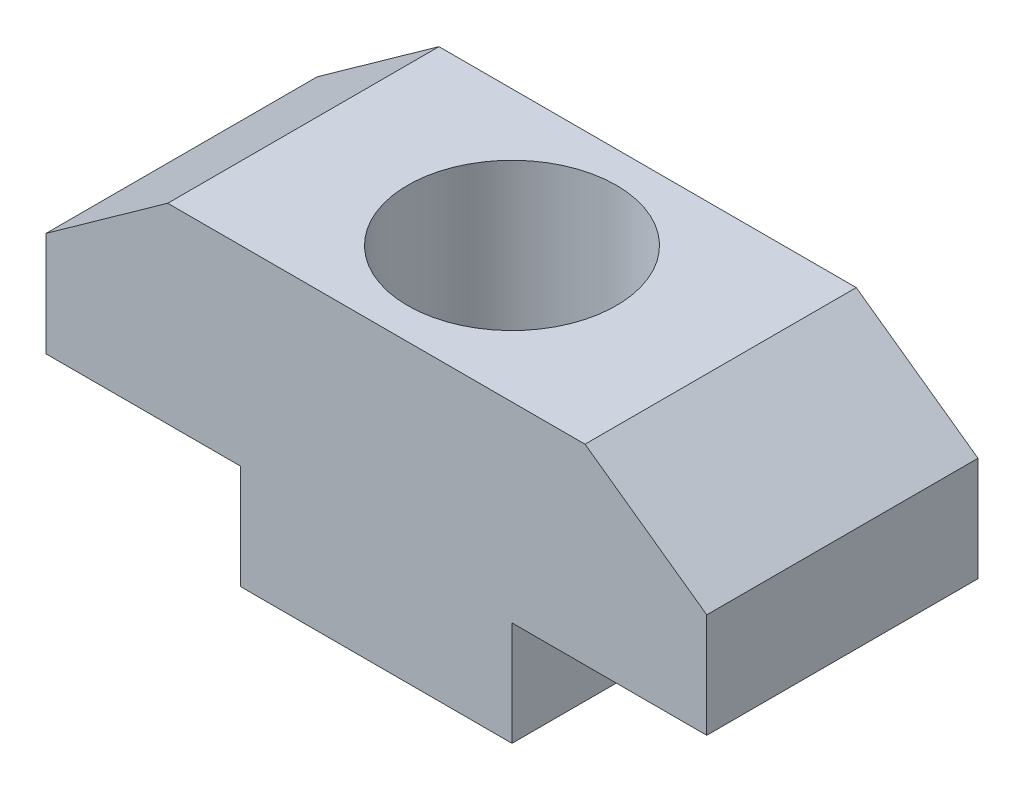
ISO-10303-21;
HEADER;
FILE_DESCRIPTION(('STEP AP214'),'2;1');
FILE_NAME('part.step','',(''),(''),'','','');
FILE_SCHEMA(('AUTOMOTIVE_DESIGN { 1 0 10303 214 1 1 1 1 }'));
ENDSEC;
DATA;
#1=APPLICATION_CONTEXT('core data for automotive mechanical design processes');
#2=APPLICATION_PROTOCOL_DEFINITION('international standard','automotive_design',2000,#1);
#3=PRODUCT_CONTEXT('',#1,'mechanical');
#4=PRODUCT('Part','Part','',(#3));
#5=PRODUCT_RELATED_PRODUCT_CATEGORY('part','',(#4));
#6=PRODUCT_DEFINITION_FORMATION('','',#4);
#7=PRODUCT_DEFINITION_CONTEXT('part definition',#1,'design');
#8=PRODUCT_DEFINITION('design','',#6,#7);
#9=PRODUCT_DEFINITION_SHAPE('','',#8);
#10=(LENGTH_UNIT() NAMED_UNIT(*) SI_UNIT(.MILLI.,.METRE.));
#11=(NAMED_UNIT(*) PLANE_ANGLE_UNIT() SI_UNIT($,.RADIAN.));
#12=(NAMED_UNIT(*) SI_UNIT($,.STERADIAN.) SOLID_ANGLE_UNIT());
#13=UNCERTAINTY_MEASURE_WITH_UNIT(LENGTH_MEASURE(1.E-05),#10,'distance_accuracy_value','');
#14=(GEOMETRIC_REPRESENTATION_CONTEXT(3) GLOBAL_UNCERTAINTY_ASSIGNED_CONTEXT((#13)) GLOBAL_UNIT_ASSIGNED_CONTEXT((#10,
#11,#12)) REPRESENTATION_CONTEXT('',''));
#15=CARTESIAN_POINT('',(0.,0.,0.));
#16=DIRECTION('',(0.,0.,1.));
#17=DIRECTION('',(1.,0.,0.));
#18=AXIS2_PLACEMENT_3D('',#15,#16,#17);
#19=CARTESIAN_POINT('',(0.,0.,7.8));
#20=DIRECTION('',(0.,1.,0.));
#21=DIRECTION('',(0.,0.,1.));
#22=AXIS2_PLACEMENT_3D('',#19,#20,#21);
#23=PLANE('',#22);
#24=DIRECTION('',(0.,0.,-1.));
#25=VECTOR('',#24,1.);
#26=CARTESIAN_POINT('',(5.6,0.,7.8));
#27=LINE('',#26,#25);
#28=CARTESIAN_POINT('',(5.6,0.,7.8));
#29=VERTEX_POINT('',#28);
#30=CARTESIAN_POINT('',(5.6,0.,0.));
#31=VERTEX_POINT('',#30);
#32=EDGE_CURVE('E51',#29,#31,#27,.T.);
#33=ORIENTED_EDGE('',*,*,#32,.F.);
#34=DIRECTION('',(1.,0.,0.));
#35=VECTOR('',#34,1.);
#36=CARTESIAN_POINT('',(0.,0.,7.8));
#37=LINE('',#36,#35);
#38=CARTESIAN_POINT('',(0.,0.,7.8));
#39=VERTEX_POINT('',#38);
#40=EDGE_CURVE('E149',#39,#29,#37,.T.);
#41=ORIENTED_EDGE('',*,*,#40,.F.);
#42=DIRECTION('',(0.,0.,-1.));
#43=VECTOR('',#42,1.);
#44=CARTESIAN_POINT('',(0.,0.,7.8));
#45=LINE('',#44,#43);
#46=CARTESIAN_POINT('',(0.,0.,0.));
#47=VERTEX_POINT('',#46);
#48=EDGE_CURVE('E11',#39,#47,#45,.T.);
#49=ORIENTED_EDGE('',*,*,#48,.T.);
#50=DIRECTION('',(1.,0.,0.));
#51=VECTOR('',#50,1.);
#52=CARTESIAN_POINT('',(0.,0.,0.));
#53=LINE('',#52,#51);
#54=EDGE_CURVE('E160',#47,#31,#53,.T.);
#55=ORIENTED_EDGE('',*,*,#54,.T.);
#56=EDGE_LOOP('',(#33,#41,#49,#55));
#57=FACE_BOUND('',#56,.T.);
#58=ADVANCED_FACE('F36',(#57),#23,.F.);
#59=DIRECTION('',(0.,0.,1.));
#60=VECTOR('',#59,1.);
#61=CARTESIAN_POINT('',(13.4,0.,7.8));
#62=LINE('',#61,#60);
#63=CARTESIAN_POINT('',(13.4,0.,0.));
#64=VERTEX_POINT('',#63);
#65=CARTESIAN_POINT('',(13.4,0.,7.8));
#66=VERTEX_POINT('',#65);
#67=EDGE_CURVE('E59',#64,#66,#62,.T.);
#68=ORIENTED_EDGE('',*,*,#67,.F.);
#69=CARTESIAN_POINT('',(19.,0.,0.));
#70=VERTEX_POINT('',#69);
#71=EDGE_CURVE('E138',#64,#70,#53,.T.);
#72=ORIENTED_EDGE('',*,*,#71,.T.);
#73=DIRECTION('',(0.,0.,-1.));
#74=VECTOR('',#73,1.);
#75=CARTESIAN_POINT('',(19.,0.,7.8));
#76=LINE('',#75,#74);
#77=CARTESIAN_POINT('',(19.,0.,7.8));
#78=VERTEX_POINT('',#77);
#79=EDGE_CURVE('E44',#78,#70,#76,.T.);
#80=ORIENTED_EDGE('',*,*,#79,.F.);
#81=EDGE_CURVE('E147',#66,#78,#37,.T.);
#82=ORIENTED_EDGE('',*,*,#81,.F.);
#83=EDGE_LOOP('',(#68,#72,#80,#82));
#84=FACE_BOUND('',#83,.T.);
#85=ADVANCED_FACE('F203',(#84),#23,.F.);
#86=CARTESIAN_POINT('',(0.,0.,7.8));
#87=DIRECTION('',(1.,0.,0.));
#88=DIRECTION('',(0.,0.,-1.));
#89=AXIS2_PLACEMENT_3D('',#86,#87,#88);
#90=PLANE('',#89);
#91=DIRECTION('',(0.,-1.,0.));
#92=VECTOR('',#91,1.);
#93=CARTESIAN_POINT('',(0.,0.,0.));
#94=LINE('',#93,#92);
#95=CARTESIAN_POINT('',(0.,3.,0.));
#96=VERTEX_POINT('',#95);
#97=EDGE_CURVE('E135',#96,#47,#94,.T.);
#98=ORIENTED_EDGE('',*,*,#97,.T.);
#99=ORIENTED_EDGE('',*,*,#48,.F.);
#100=DIRECTION('',(0.,-1.,0.));
#101=VECTOR('',#100,1.);
#102=CARTESIAN_POINT('',(0.,0.,7.8));
#103=LINE('',#102,#101);
#104=CARTESIAN_POINT('',(0.,3.,7.8));
#105=VERTEX_POINT('',#104);
#106=EDGE_CURVE('E144',#105,#39,#103,.T.);
#107=ORIENTED_EDGE('',*,*,#106,.F.);
#108=DIRECTION('',(0.,0.,-1.));
#109=VECTOR('',#108,1.);
#110=CARTESIAN_POINT('',(0.,3.,7.8));
#111=LINE('',#110,#109);
#112=EDGE_CURVE('E158',#105,#96,#111,.T.);
#113=ORIENTED_EDGE('',*,*,#112,.T.);
#114=EDGE_LOOP('',(#98,#99,#107,#113));
#115=FACE_BOUND('',#114,.T.);
#116=ADVANCED_FACE('F38',(#115),#90,.F.);
#117=CARTESIAN_POINT('',(19.,0.,7.8));
#118=DIRECTION('',(-1.,0.,0.));
#119=DIRECTION('',(0.,0.,1.));
#120=AXIS2_PLACEMENT_3D('',#117,#118,#119);
#121=PLANE('',#120);
#122=DIRECTION('',(0.,1.,0.));
#123=VECTOR('',#122,1.);
#124=CARTESIAN_POINT('',(19.,0.,0.));
#125=LINE('',#124,#123);
#126=CARTESIAN_POINT('',(19.,3.,0.));
#127=VERTEX_POINT('',#126);
#128=EDGE_CURVE('E162',#70,#127,#125,.T.);
#129=ORIENTED_EDGE('',*,*,#128,.T.);
#130=DIRECTION('',(0.,0.,-1.));
#131=VECTOR('',#130,1.);
#132=CARTESIAN_POINT('',(19.,3.,7.8));
#133=LINE('',#132,#131);
#134=CARTESIAN_POINT('',(19.,3.,7.8));
#135=VERTEX_POINT('',#134);
#136=EDGE_CURVE('E177',#135,#127,#133,.T.);
#137=ORIENTED_EDGE('',*,*,#136,.F.);
#138=DIRECTION('',(0.,1.,0.));
#139=VECTOR('',#138,1.);
#140=CARTESIAN_POINT('',(19.,0.,7.8));
#141=LINE('',#140,#139);
#142=EDGE_CURVE('E151',#78,#135,#141,.T.);
#143=ORIENTED_EDGE('',*,*,#142,.F.);
#144=ORIENTED_EDGE('',*,*,#79,.T.);
#145=EDGE_LOOP('',(#129,#137,#143,#144));
#146=FACE_BOUND('',#145,.T.);
#147=ADVANCED_FACE('F184',(#146),#121,.F.);
#148=CARTESIAN_POINT('',(15.5,5.5,7.8));
#149=DIRECTION('',(-0.581238193719096,-0.813733471206735,0.));
#150=DIRECTION('',(0.813733471206735,-0.581238193719096,0.));
#151=AXIS2_PLACEMENT_3D('',#148,#149,#150);
#152=PLANE('',#151);
#153=DIRECTION('',(-0.813733471206735,0.581238193719096,0.));
#154=VECTOR('',#153,1.);
#155=CARTESIAN_POINT('',(15.5,5.5,0.));
#156=LINE('',#155,#154);
#157=CARTESIAN_POINT('',(15.5,5.5,0.));
#158=VERTEX_POINT('',#157);
#159=EDGE_CURVE('E164',#127,#158,#156,.T.);
#160=ORIENTED_EDGE('',*,*,#159,.T.);
#161=DIRECTION('',(0.,0.,-1.));
#162=VECTOR('',#161,1.);
#163=CARTESIAN_POINT('',(15.5,5.5,7.8));
#164=LINE('',#163,#162);
#165=CARTESIAN_POINT('',(15.5,5.5,7.8));
#166=VERTEX_POINT('',#165);
#167=EDGE_CURVE('E174',#166,#158,#164,.T.);
#168=ORIENTED_EDGE('',*,*,#167,.F.);
#169=DIRECTION('',(-0.813733471206735,0.581238193719096,0.));
#170=VECTOR('',#169,1.);
#171=CARTESIAN_POINT('',(15.5,5.5,7.8));
#172=LINE('',#171,#170);
#173=EDGE_CURVE('E153',#135,#166,#172,.T.);
#174=ORIENTED_EDGE('',*,*,#173,.F.);
#175=ORIENTED_EDGE('',*,*,#136,.T.);
#176=EDGE_LOOP('',(#160,#168,#174,#175));
#177=FACE_BOUND('',#176,.T.);
#178=ADVANCED_FACE('F191',(#177),#152,.F.);
#179=CARTESIAN_POINT('',(3.5,5.5,7.8));
#180=DIRECTION('',(0.,-1.,0.));
#181=DIRECTION('',(0.,0.,-1.));
#182=AXIS2_PLACEMENT_3D('',#179,#180,#181);
#183=PLANE('',#182);
#184=CARTESIAN_POINT('',(9.5,5.5,3.9));
#185=DIRECTION('',(0.,-1.,0.));
#186=DIRECTION('',(0.,0.,-1.));
#187=AXIS2_PLACEMENT_3D('',#184,#185,#186);
#188=CIRCLE('',#187,3.);
#189=CARTESIAN_POINT('',(9.5,5.5,0.899999999999999));
#190=VERTEX_POINT('',#189);
#191=EDGE_CURVE('E207',#190,#190,#188,.F.);
#192=ORIENTED_EDGE('',*,*,#191,.F.);
#193=EDGE_LOOP('',(#192));
#194=FACE_BOUND('',#193,.T.);
#195=DIRECTION('',(-1.,0.,0.));
#196=VECTOR('',#195,1.);
#197=CARTESIAN_POINT('',(3.5,5.5,0.));
#198=LINE('',#197,#196);
#199=CARTESIAN_POINT('',(3.5,5.5,0.));
#200=VERTEX_POINT('',#199);
#201=EDGE_CURVE('E166',#158,#200,#198,.T.);
#202=ORIENTED_EDGE('',*,*,#201,.T.);
#203=DIRECTION('',(0.,0.,-1.));
#204=VECTOR('',#203,1.);
#205=CARTESIAN_POINT('',(3.5,5.5,7.8));
#206=LINE('',#205,#204);
#207=CARTESIAN_POINT('',(3.5,5.5,7.8));
#208=VERTEX_POINT('',#207);
#209=EDGE_CURVE('E171',#208,#200,#206,.T.);
#210=ORIENTED_EDGE('',*,*,#209,.F.);
#211=DIRECTION('',(-1.,0.,0.));
#212=VECTOR('',#211,1.);
#213=CARTESIAN_POINT('',(3.5,5.5,7.8));
#214=LINE('',#213,#212);
#215=EDGE_CURVE('E155',#166,#208,#214,.T.);
#216=ORIENTED_EDGE('',*,*,#215,.F.);
#217=ORIENTED_EDGE('',*,*,#167,.T.);
#218=EDGE_LOOP('',(#202,#210,#216,#217));
#219=FACE_BOUND('',#218,.T.);
#220=ADVANCED_FACE('F195',(#194,#219),#183,.F.);
#221=CARTESIAN_POINT('',(0.,3.,7.8));
#222=DIRECTION('',(0.581238193719096,-0.813733471206735,0.));
#223=DIRECTION('',(0.813733471206735,0.581238193719096,0.));
#224=AXIS2_PLACEMENT_3D('',#221,#222,#223);
#225=PLANE('',#224);
#226=DIRECTION('',(-0.813733471206735,-0.581238193719096,0.));
#227=VECTOR('',#226,1.);
#228=CARTESIAN_POINT('',(0.,3.,0.));
#229=LINE('',#228,#227);
#230=EDGE_CURVE('E148',#200,#96,#229,.T.);
#231=ORIENTED_EDGE('',*,*,#230,.T.);
#232=ORIENTED_EDGE('',*,*,#112,.F.);
#233=DIRECTION('',(-0.813733471206735,-0.581238193719096,0.));
#234=VECTOR('',#233,1.);
#235=CARTESIAN_POINT('',(0.,3.,7.8));
#236=LINE('',#235,#234);
#237=EDGE_CURVE('E157',#208,#105,#236,.T.);
#238=ORIENTED_EDGE('',*,*,#237,.F.);
#239=ORIENTED_EDGE('',*,*,#209,.T.);
#240=EDGE_LOOP('',(#231,#232,#238,#239));
#241=FACE_BOUND('',#240,.T.);
#242=ADVANCED_FACE('F244',(#241),#225,.F.);
#243=CARTESIAN_POINT('',(0.,0.,7.8));
#244=DIRECTION('',(0.,0.,-1.));
#245=DIRECTION('',(-1.,0.,0.));
#246=AXIS2_PLACEMENT_3D('',#243,#244,#245);
#247=PLANE('',#246);
#248=ORIENTED_EDGE('',*,*,#106,.T.);
#249=ORIENTED_EDGE('',*,*,#40,.T.);
#250=DIRECTION('',(0.,1.,0.));
#251=VECTOR('',#250,1.);
#252=CARTESIAN_POINT('',(5.6,-3.,7.8));
#253=LINE('',#252,#251);
#254=CARTESIAN_POINT('',(5.6,-3.,7.8));
#255=VERTEX_POINT('',#254);
#256=EDGE_CURVE('E211',#255,#29,#253,.T.);
#257=ORIENTED_EDGE('',*,*,#256,.F.);
#258=DIRECTION('',(-1.,0.,0.));
#259=VECTOR('',#258,1.);
#260=CARTESIAN_POINT('',(5.6,-3.,7.8));
#261=LINE('',#260,#259);
#262=CARTESIAN_POINT('',(13.4,-3.,7.8));
#263=VERTEX_POINT('',#262);
#264=EDGE_CURVE('E129',#263,#255,#261,.T.);
#265=ORIENTED_EDGE('',*,*,#264,.F.);
#266=DIRECTION('',(0.,1.,0.));
#267=VECTOR('',#266,1.);
#268=CARTESIAN_POINT('',(13.4,-3.,7.8));
#269=LINE('',#268,#267);
#270=EDGE_CURVE('E140',#263,#66,#269,.T.);
#271=ORIENTED_EDGE('',*,*,#270,.T.);
#272=ORIENTED_EDGE('',*,*,#81,.T.);
#273=ORIENTED_EDGE('',*,*,#142,.T.);
#274=ORIENTED_EDGE('',*,*,#173,.T.);
#275=ORIENTED_EDGE('',*,*,#215,.T.);
#276=ORIENTED_EDGE('',*,*,#237,.T.);
#277=EDGE_LOOP('',(#248,#249,#257,#265,#271,#272,#273,#274,#275,#276));
#278=FACE_BOUND('',#277,.T.);
#279=ADVANCED_FACE('F199',(#278),#247,.F.);
#280=CARTESIAN_POINT('',(0.,0.,0.));
#281=DIRECTION('',(0.,0.,-1.));
#282=DIRECTION('',(-1.,0.,0.));
#283=AXIS2_PLACEMENT_3D('',#280,#281,#282);
#284=PLANE('',#283);
#285=ORIENTED_EDGE('',*,*,#97,.F.);
#286=ORIENTED_EDGE('',*,*,#230,.F.);
#287=ORIENTED_EDGE('',*,*,#201,.F.);
#288=ORIENTED_EDGE('',*,*,#159,.F.);
#289=ORIENTED_EDGE('',*,*,#128,.F.);
#290=ORIENTED_EDGE('',*,*,#71,.F.);
#291=DIRECTION('',(0.,1.,0.));
#292=VECTOR('',#291,1.);
#293=CARTESIAN_POINT('',(13.4,-3.,0.));
#294=LINE('',#293,#292);
#295=CARTESIAN_POINT('',(13.4,-3.,0.));
#296=VERTEX_POINT('',#295);
#297=EDGE_CURVE('E120',#296,#64,#294,.T.);
#298=ORIENTED_EDGE('',*,*,#297,.F.);
#299=DIRECTION('',(1.,0.,0.));
#300=VECTOR('',#299,1.);
#301=CARTESIAN_POINT('',(5.6,-3.,0.));
#302=LINE('',#301,#300);
#303=CARTESIAN_POINT('',(5.6,-3.,0.));
#304=VERTEX_POINT('',#303);
#305=EDGE_CURVE('E113',#304,#296,#302,.T.);
#306=ORIENTED_EDGE('',*,*,#305,.F.);
#307=DIRECTION('',(0.,1.,0.));
#308=VECTOR('',#307,1.);
#309=CARTESIAN_POINT('',(5.6,-3.,0.));
#310=LINE('',#309,#308);
#311=EDGE_CURVE('E118',#304,#31,#310,.T.);
#312=ORIENTED_EDGE('',*,*,#311,.T.);
#313=ORIENTED_EDGE('',*,*,#54,.F.);
#314=EDGE_LOOP('',(#285,#286,#287,#288,#289,#290,#298,#306,#312,#313));
#315=FACE_BOUND('',#314,.T.);
#316=ADVANCED_FACE('F116',(#315),#284,.T.);
#317=CARTESIAN_POINT('',(5.6,-3.,7.8));
#318=DIRECTION('',(1.,0.,0.));
#319=DIRECTION('',(0.,0.,-1.));
#320=AXIS2_PLACEMENT_3D('',#317,#318,#319);
#321=PLANE('',#320);
#322=ORIENTED_EDGE('',*,*,#32,.T.);
#323=ORIENTED_EDGE('',*,*,#311,.F.);
#324=DIRECTION('',(0.,0.,-1.));
#325=VECTOR('',#324,1.);
#326=CARTESIAN_POINT('',(5.6,-3.,7.8));
#327=LINE('',#326,#325);
#328=EDGE_CURVE('E124',#255,#304,#327,.T.);
#329=ORIENTED_EDGE('',*,*,#328,.F.);
#330=ORIENTED_EDGE('',*,*,#256,.T.);
#331=EDGE_LOOP('',(#322,#323,#329,#330));
#332=FACE_BOUND('',#331,.T.);
#333=ADVANCED_FACE('F134',(#332),#321,.F.);
#334=CARTESIAN_POINT('',(13.4,-3.,7.8));
#335=DIRECTION('',(-1.,0.,0.));
#336=DIRECTION('',(0.,0.,1.));
#337=AXIS2_PLACEMENT_3D('',#334,#335,#336);
#338=PLANE('',#337);
#339=ORIENTED_EDGE('',*,*,#67,.T.);
#340=ORIENTED_EDGE('',*,*,#270,.F.);
#341=DIRECTION('',(0.,0.,1.));
#342=VECTOR('',#341,1.);
#343=CARTESIAN_POINT('',(13.4,-3.,7.8));
#344=LINE('',#343,#342);
#345=EDGE_CURVE('E123',#296,#263,#344,.T.);
#346=ORIENTED_EDGE('',*,*,#345,.F.);
#347=ORIENTED_EDGE('',*,*,#297,.T.);
#348=EDGE_LOOP('',(#339,#340,#346,#347));
#349=FACE_BOUND('',#348,.T.);
#350=ADVANCED_FACE('F205',(#349),#338,.F.);
#351=CARTESIAN_POINT('',(0.,-3.,0.));
#352=DIRECTION('',(0.,-1.,0.));
#353=DIRECTION('',(0.,0.,-1.));
#354=AXIS2_PLACEMENT_3D('',#351,#352,#353);
#355=PLANE('',#354);
#356=CARTESIAN_POINT('',(9.5,-3.,3.9));
#357=DIRECTION('',(0.,-1.,0.));
#358=DIRECTION('',(0.,0.,-1.));
#359=AXIS2_PLACEMENT_3D('',#356,#357,#358);
#360=CIRCLE('',#359,3.);
#361=CARTESIAN_POINT('',(9.5,-3.,0.899999999999999));
#362=VERTEX_POINT('',#361);
#363=EDGE_CURVE('E216',#362,#362,#360,.T.);
#364=ORIENTED_EDGE('',*,*,#363,.F.);
#365=EDGE_LOOP('',(#364));
#366=FACE_BOUND('',#365,.T.);
#367=ORIENTED_EDGE('',*,*,#328,.T.);
#368=ORIENTED_EDGE('',*,*,#305,.T.);
#369=ORIENTED_EDGE('',*,*,#345,.T.);
#370=ORIENTED_EDGE('',*,*,#264,.T.);
#371=EDGE_LOOP('',(#367,#368,#369,#370));
#372=FACE_BOUND('',#371,.T.);
#373=ADVANCED_FACE('F127',(#366,#372),#355,.T.);
#374=CARTESIAN_POINT('',(9.5,5.501,3.9));
#375=DIRECTION('',(0.,-1.,0.));
#376=DIRECTION('',(0.,0.,-1.));
#377=AXIS2_PLACEMENT_3D('',#374,#375,#376);
#378=CYLINDRICAL_SURFACE('',#377,3.);
#379=ORIENTED_EDGE('',*,*,#363,.T.);
#380=EDGE_LOOP('',(#379));
#381=FACE_BOUND('',#380,.T.);
#382=ORIENTED_EDGE('',*,*,#191,.T.);
#383=EDGE_LOOP('',(#382));
#384=FACE_BOUND('',#383,.T.);
#385=ADVANCED_FACE('F220',(#381,#384),#378,.F.);
#386=CLOSED_SHELL('',(#58,#85,#116,#147,#178,#220,#242,#279,#316,#333,#350,#373,#385));
#387=MANIFOLD_SOLID_BREP('B2',#386);
#388=ADVANCED_BREP_SHAPE_REPRESENTATION('',(#18,#387),#14);
#389=SHAPE_DEFINITION_REPRESENTATION(#9,#388);
ENDSEC;
END-ISO-10303-21;
